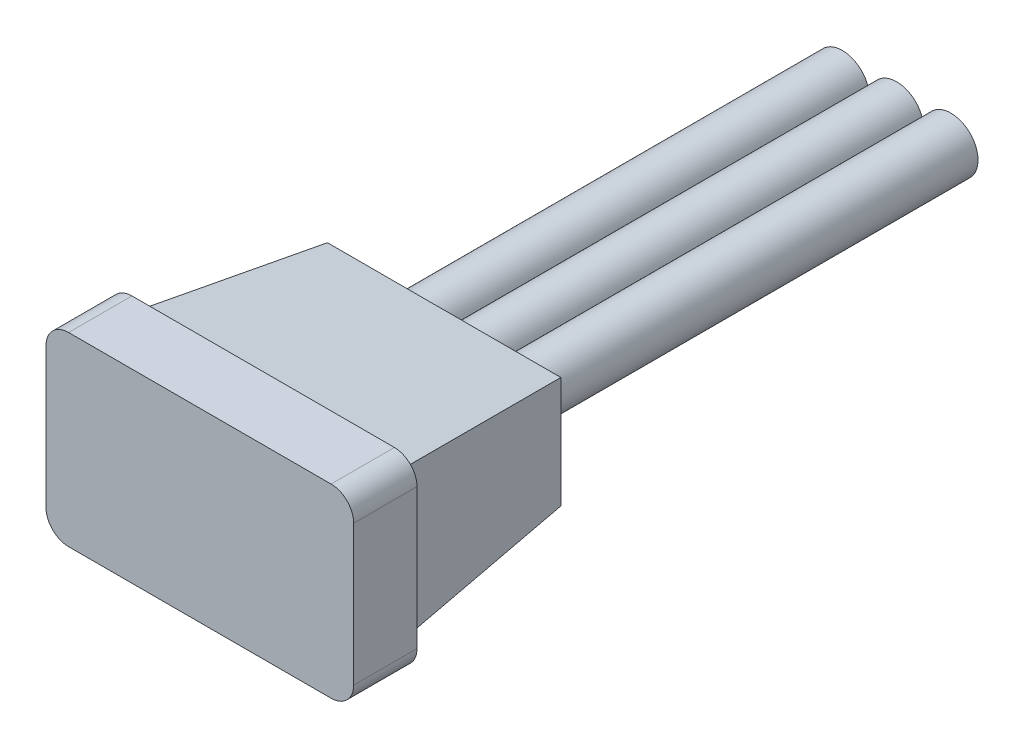
ISO-10303-21;
HEADER;
FILE_DESCRIPTION(('STEP AP214'),'2;1');
FILE_NAME('part.step','',(''),(''),'','','');
FILE_SCHEMA(('AUTOMOTIVE_DESIGN { 1 0 10303 214 1 1 1 1 }'));
ENDSEC;
DATA;
#1=APPLICATION_CONTEXT('core data for automotive mechanical design processes');
#2=APPLICATION_PROTOCOL_DEFINITION('international standard','automotive_design',2000,#1);
#3=PRODUCT_CONTEXT('',#1,'mechanical');
#4=PRODUCT('Part','Part','',(#3));
#5=PRODUCT_RELATED_PRODUCT_CATEGORY('part','',(#4));
#6=PRODUCT_DEFINITION_FORMATION('','',#4);
#7=PRODUCT_DEFINITION_CONTEXT('part definition',#1,'design');
#8=PRODUCT_DEFINITION('design','',#6,#7);
#9=PRODUCT_DEFINITION_SHAPE('','',#8);
#10=(LENGTH_UNIT() NAMED_UNIT(*) SI_UNIT(.MILLI.,.METRE.));
#11=(NAMED_UNIT(*) PLANE_ANGLE_UNIT() SI_UNIT($,.RADIAN.));
#12=(NAMED_UNIT(*) SI_UNIT($,.STERADIAN.) SOLID_ANGLE_UNIT());
#13=UNCERTAINTY_MEASURE_WITH_UNIT(LENGTH_MEASURE(1.E-05),#10,'distance_accuracy_value','');
#14=(GEOMETRIC_REPRESENTATION_CONTEXT(3) GLOBAL_UNCERTAINTY_ASSIGNED_CONTEXT((#13)) GLOBAL_UNIT_ASSIGNED_CONTEXT((#10,
#11,#12)) REPRESENTATION_CONTEXT('',''));
#15=CARTESIAN_POINT('',(0.,0.,0.));
#16=DIRECTION('',(0.,0.,1.));
#17=DIRECTION('',(1.,0.,0.));
#18=AXIS2_PLACEMENT_3D('',#15,#16,#17);
#19=CARTESIAN_POINT('',(1.2,0.,-17.0970562748477));
#20=DIRECTION('',(0.,0.,1.));
#21=DIRECTION('',(1.,0.,0.));
#22=AXIS2_PLACEMENT_3D('',#19,#20,#21);
#23=CYLINDRICAL_SURFACE('',#22,0.6);
#24=CARTESIAN_POINT('',(1.2,0.,-5.4));
#25=DIRECTION('',(0.,0.,-1.));
#26=DIRECTION('',(-1.,0.,0.));
#27=AXIS2_PLACEMENT_3D('',#24,#25,#26);
#28=CIRCLE('',#27,0.6);
#29=CARTESIAN_POINT('',(0.6,0.,-5.4));
#30=VERTEX_POINT('',#29);
#31=EDGE_CURVE('E48',#30,#30,#28,.T.);
#32=ORIENTED_EDGE('',*,*,#31,.T.);
#33=EDGE_LOOP('',(#32));
#34=FACE_BOUND('',#33,.T.);
#35=CARTESIAN_POINT('',(1.2,0.,-15.4));
#36=DIRECTION('',(0.,0.,-1.));
#37=DIRECTION('',(-1.,0.,0.));
#38=AXIS2_PLACEMENT_3D('',#35,#36,#37);
#39=CIRCLE('',#38,0.6);
#40=CARTESIAN_POINT('',(0.6,0.,-15.4));
#41=VERTEX_POINT('',#40);
#42=EDGE_CURVE('E11',#41,#41,#39,.T.);
#43=ORIENTED_EDGE('',*,*,#42,.F.);
#44=EDGE_LOOP('',(#43));
#45=FACE_BOUND('',#44,.T.);
#46=ADVANCED_FACE('F41',(#34,#45),#23,.T.);
#47=CARTESIAN_POINT('',(1.2,0.,-5.4));
#48=DIRECTION('',(0.,0.,-1.));
#49=DIRECTION('',(-1.,0.,0.));
#50=AXIS2_PLACEMENT_3D('',#47,#48,#49);
#51=PLANE('',#50);
#52=ORIENTED_EDGE('',*,*,#31,.F.);
#53=EDGE_LOOP('',(#52));
#54=FACE_BOUND('',#53,.T.);
#55=ADVANCED_FACE('F56',(#54),#51,.F.);
#56=CARTESIAN_POINT('',(0.,0.,-15.4));
#57=DIRECTION('',(0.,0.,-1.));
#58=DIRECTION('',(-1.,0.,0.));
#59=AXIS2_PLACEMENT_3D('',#56,#57,#58);
#60=PLANE('',#59);
#61=ORIENTED_EDGE('',*,*,#42,.T.);
#62=EDGE_LOOP('',(#61));
#63=FACE_BOUND('',#62,.T.);
#64=ADVANCED_FACE('F43',(#63),#60,.T.);
#65=CLOSED_SHELL('',(#46,#55,#64));
#66=MANIFOLD_SOLID_BREP('B2',#65);
#67=CARTESIAN_POINT('',(-1.2,0.,-17.0970562748477));
#68=DIRECTION('',(0.,0.,1.));
#69=DIRECTION('',(1.,0.,0.));
#70=AXIS2_PLACEMENT_3D('',#67,#68,#69);
#71=CYLINDRICAL_SURFACE('',#70,0.6);
#72=CARTESIAN_POINT('',(-1.2,0.,-5.4));
#73=DIRECTION('',(0.,0.,-1.));
#74=DIRECTION('',(-1.,0.,0.));
#75=AXIS2_PLACEMENT_3D('',#72,#73,#74);
#76=CIRCLE('',#75,0.6);
#77=CARTESIAN_POINT('',(-1.8,0.,-5.4));
#78=VERTEX_POINT('',#77);
#79=EDGE_CURVE('E96',#78,#78,#76,.T.);
#80=ORIENTED_EDGE('',*,*,#79,.T.);
#81=EDGE_LOOP('',(#80));
#82=FACE_BOUND('',#81,.T.);
#83=CARTESIAN_POINT('',(-1.2,0.,-15.4));
#84=DIRECTION('',(0.,0.,-1.));
#85=DIRECTION('',(-1.,0.,0.));
#86=AXIS2_PLACEMENT_3D('',#83,#84,#85);
#87=CIRCLE('',#86,0.6);
#88=CARTESIAN_POINT('',(-1.8,0.,-15.4));
#89=VERTEX_POINT('',#88);
#90=EDGE_CURVE('E40',#89,#89,#87,.T.);
#91=ORIENTED_EDGE('',*,*,#90,.F.);
#92=EDGE_LOOP('',(#91));
#93=FACE_BOUND('',#92,.T.);
#94=ADVANCED_FACE('F89',(#82,#93),#71,.T.);
#95=CARTESIAN_POINT('',(-1.2,0.,-5.4));
#96=DIRECTION('',(0.,0.,-1.));
#97=DIRECTION('',(-1.,0.,0.));
#98=AXIS2_PLACEMENT_3D('',#95,#96,#97);
#99=PLANE('',#98);
#100=ORIENTED_EDGE('',*,*,#79,.F.);
#101=EDGE_LOOP('',(#100));
#102=FACE_BOUND('',#101,.T.);
#103=ADVANCED_FACE('F104',(#102),#99,.F.);
#104=CARTESIAN_POINT('',(0.,0.,-15.4));
#105=DIRECTION('',(0.,0.,-1.));
#106=DIRECTION('',(-1.,0.,0.));
#107=AXIS2_PLACEMENT_3D('',#104,#105,#106);
#108=PLANE('',#107);
#109=ORIENTED_EDGE('',*,*,#90,.T.);
#110=EDGE_LOOP('',(#109));
#111=FACE_BOUND('',#110,.T.);
#112=ADVANCED_FACE('F91',(#111),#108,.T.);
#113=CLOSED_SHELL('',(#94,#103,#112));
#114=MANIFOLD_SOLID_BREP('B6',#113);
#115=CARTESIAN_POINT('',(0.,0.,-15.4));
#116=DIRECTION('',(0.,0.,1.));
#117=DIRECTION('',(1.,0.,0.));
#118=AXIS2_PLACEMENT_3D('',#115,#116,#117);
#119=CYLINDRICAL_SURFACE('',#118,0.6);
#120=CARTESIAN_POINT('',(0.,0.,-15.4));
#121=DIRECTION('',(0.,0.,-1.));
#122=DIRECTION('',(-1.,0.,0.));
#123=AXIS2_PLACEMENT_3D('',#120,#121,#122);
#124=CIRCLE('',#123,0.6);
#125=CARTESIAN_POINT('',(-0.6,0.,-15.4));
#126=VERTEX_POINT('',#125);
#127=EDGE_CURVE('E88',#126,#126,#124,.T.);
#128=ORIENTED_EDGE('',*,*,#127,.F.);
#129=EDGE_LOOP('',(#128));
#130=FACE_BOUND('',#129,.T.);
#131=CARTESIAN_POINT('',(0.,0.,-5.4));
#132=DIRECTION('',(0.,0.,-1.));
#133=DIRECTION('',(-1.,0.,0.));
#134=AXIS2_PLACEMENT_3D('',#131,#132,#133);
#135=CIRCLE('',#134,0.6);
#136=CARTESIAN_POINT('',(-0.6,0.,-5.4));
#137=VERTEX_POINT('',#136);
#138=EDGE_CURVE('E141',#137,#137,#135,.T.);
#139=ORIENTED_EDGE('',*,*,#138,.T.);
#140=EDGE_LOOP('',(#139));
#141=FACE_BOUND('',#140,.T.);
#142=ADVANCED_FACE('F138',(#130,#141),#119,.T.);
#143=CARTESIAN_POINT('',(0.,0.,-15.4));
#144=DIRECTION('',(0.,0.,-1.));
#145=DIRECTION('',(-1.,0.,0.));
#146=AXIS2_PLACEMENT_3D('',#143,#144,#145);
#147=PLANE('',#146);
#148=ORIENTED_EDGE('',*,*,#127,.T.);
#149=EDGE_LOOP('',(#148));
#150=FACE_BOUND('',#149,.T.);
#151=ADVANCED_FACE('F153',(#150),#147,.T.);
#152=CARTESIAN_POINT('',(0.,0.,-5.4));
#153=DIRECTION('',(0.,0.,-1.));
#154=DIRECTION('',(-1.,0.,0.));
#155=AXIS2_PLACEMENT_3D('',#152,#153,#154);
#156=PLANE('',#155);
#157=ORIENTED_EDGE('',*,*,#138,.F.);
#158=EDGE_LOOP('',(#157));
#159=FACE_BOUND('',#158,.T.);
#160=ADVANCED_FACE('F151',(#159),#156,.F.);
#161=CLOSED_SHELL('',(#142,#151,#160));
#162=MANIFOLD_SOLID_BREP('B35',#161);
#163=CARTESIAN_POINT('',(0.,0.,-1.4));
#164=DIRECTION('',(0.,0.,1.));
#165=DIRECTION('',(1.,0.,0.));
#166=AXIS2_PLACEMENT_3D('',#163,#164,#165);
#167=PLANE('',#166);
#168=DIRECTION('',(1.,0.,0.));
#169=VECTOR('',#168,1.);
#170=CARTESIAN_POINT('',(-3.4,-2.05,-1.4));
#171=LINE('',#170,#169);
#172=CARTESIAN_POINT('',(-2.9,-2.05,-1.4));
#173=VERTEX_POINT('',#172);
#174=CARTESIAN_POINT('',(2.9,-2.05,-1.4));
#175=VERTEX_POINT('',#174);
#176=EDGE_CURVE('E316',#173,#175,#171,.T.);
#177=ORIENTED_EDGE('',*,*,#176,.F.);
#178=CARTESIAN_POINT('',(-2.9,-1.55,-1.4));
#179=DIRECTION('',(0.,0.,1.));
#180=DIRECTION('',(1.,0.,0.));
#181=AXIS2_PLACEMENT_3D('',#178,#179,#180);
#182=CIRCLE('',#181,0.5);
#183=CARTESIAN_POINT('',(-3.4,-1.55,-1.4));
#184=VERTEX_POINT('',#183);
#185=EDGE_CURVE('E353',#173,#184,#182,.F.);
#186=ORIENTED_EDGE('',*,*,#185,.T.);
#187=DIRECTION('',(0.,-1.,0.));
#188=VECTOR('',#187,1.);
#189=CARTESIAN_POINT('',(-3.4,2.05,-1.4));
#190=LINE('',#189,#188);
#191=CARTESIAN_POINT('',(-3.4,1.55,-1.4));
#192=VERTEX_POINT('',#191);
#193=EDGE_CURVE('E313',#192,#184,#190,.T.);
#194=ORIENTED_EDGE('',*,*,#193,.F.);
#195=CARTESIAN_POINT('',(-2.9,1.55,-1.4));
#196=DIRECTION('',(0.,0.,1.));
#197=DIRECTION('',(1.,0.,0.));
#198=AXIS2_PLACEMENT_3D('',#195,#196,#197);
#199=CIRCLE('',#198,0.5);
#200=CARTESIAN_POINT('',(-2.9,2.05,-1.4));
#201=VERTEX_POINT('',#200);
#202=EDGE_CURVE('E193',#192,#201,#199,.F.);
#203=ORIENTED_EDGE('',*,*,#202,.T.);
#204=DIRECTION('',(-1.,0.,0.));
#205=VECTOR('',#204,1.);
#206=CARTESIAN_POINT('',(-3.4,2.05,-1.4));
#207=LINE('',#206,#205);
#208=CARTESIAN_POINT('',(2.9,2.05,-1.4));
#209=VERTEX_POINT('',#208);
#210=EDGE_CURVE('E310',#209,#201,#207,.T.);
#211=ORIENTED_EDGE('',*,*,#210,.F.);
#212=CARTESIAN_POINT('',(2.9,1.55,-1.4));
#213=DIRECTION('',(0.,0.,1.));
#214=DIRECTION('',(1.,0.,0.));
#215=AXIS2_PLACEMENT_3D('',#212,#213,#214);
#216=CIRCLE('',#215,0.5);
#217=CARTESIAN_POINT('',(3.4,1.55,-1.4));
#218=VERTEX_POINT('',#217);
#219=EDGE_CURVE('E348',#209,#218,#216,.F.);
#220=ORIENTED_EDGE('',*,*,#219,.T.);
#221=DIRECTION('',(0.,1.,0.));
#222=VECTOR('',#221,1.);
#223=CARTESIAN_POINT('',(3.4,2.05,-1.4));
#224=LINE('',#223,#222);
#225=CARTESIAN_POINT('',(3.4,-1.55,-1.4));
#226=VERTEX_POINT('',#225);
#227=EDGE_CURVE('E307',#226,#218,#224,.T.);
#228=ORIENTED_EDGE('',*,*,#227,.F.);
#229=CARTESIAN_POINT('',(2.9,-1.55,-1.4));
#230=DIRECTION('',(0.,0.,1.));
#231=DIRECTION('',(1.,0.,0.));
#232=AXIS2_PLACEMENT_3D('',#229,#230,#231);
#233=CIRCLE('',#232,0.5);
#234=EDGE_CURVE('E350',#226,#175,#233,.F.);
#235=ORIENTED_EDGE('',*,*,#234,.T.);
#236=EDGE_LOOP('',(#177,#186,#194,#203,#211,#220,#228,#235));
#237=FACE_BOUND('',#236,.T.);
#238=DIRECTION('',(0.,-1.,0.));
#239=VECTOR('',#238,1.);
#240=CARTESIAN_POINT('',(3.,1.65,-1.4));
#241=LINE('',#240,#239);
#242=CARTESIAN_POINT('',(3.,1.65,-1.4));
#243=VERTEX_POINT('',#242);
#244=CARTESIAN_POINT('',(3.,-1.65,-1.4));
#245=VERTEX_POINT('',#244);
#246=EDGE_CURVE('E267',#243,#245,#241,.T.);
#247=ORIENTED_EDGE('',*,*,#246,.F.);
#248=DIRECTION('',(1.,0.,0.));
#249=VECTOR('',#248,1.);
#250=CARTESIAN_POINT('',(-3.,1.65,-1.4));
#251=LINE('',#250,#249);
#252=CARTESIAN_POINT('',(-3.,1.65,-1.4));
#253=VERTEX_POINT('',#252);
#254=EDGE_CURVE('E269',#253,#243,#251,.T.);
#255=ORIENTED_EDGE('',*,*,#254,.F.);
#256=DIRECTION('',(0.,1.,0.));
#257=VECTOR('',#256,1.);
#258=CARTESIAN_POINT('',(-3.,1.65,-1.4));
#259=LINE('',#258,#257);
#260=CARTESIAN_POINT('',(-3.,-1.65,-1.4));
#261=VERTEX_POINT('',#260);
#262=EDGE_CURVE('E288',#261,#253,#259,.T.);
#263=ORIENTED_EDGE('',*,*,#262,.F.);
#264=DIRECTION('',(-1.,0.,0.));
#265=VECTOR('',#264,1.);
#266=CARTESIAN_POINT('',(-3.,-1.65,-1.4));
#267=LINE('',#266,#265);
#268=EDGE_CURVE('E272',#245,#261,#267,.T.);
#269=ORIENTED_EDGE('',*,*,#268,.F.);
#270=EDGE_LOOP('',(#247,#255,#263,#269));
#271=FACE_BOUND('',#270,.T.);
#272=ADVANCED_FACE('F178',(#237,#271),#167,.F.);
#273=CARTESIAN_POINT('',(3.4,2.05,-1.4));
#274=DIRECTION('',(1.,0.,0.));
#275=DIRECTION('',(0.,1.,0.));
#276=AXIS2_PLACEMENT_3D('',#273,#274,#275);
#277=PLANE('',#276);
#278=DIRECTION('',(0.,1.,0.));
#279=VECTOR('',#278,1.);
#280=CARTESIAN_POINT('',(3.4,2.05,0.));
#281=LINE('',#280,#279);
#282=CARTESIAN_POINT('',(3.4,-1.55,0.));
#283=VERTEX_POINT('',#282);
#284=CARTESIAN_POINT('',(3.4,1.55,0.));
#285=VERTEX_POINT('',#284);
#286=EDGE_CURVE('E320',#283,#285,#281,.T.);
#287=ORIENTED_EDGE('',*,*,#286,.F.);
#288=DIRECTION('',(0.,0.,1.));
#289=VECTOR('',#288,1.);
#290=CARTESIAN_POINT('',(3.4,-1.55,-1.4));
#291=LINE('',#290,#289);
#292=EDGE_CURVE('E136',#283,#226,#291,.F.);
#293=ORIENTED_EDGE('',*,*,#292,.T.);
#294=ORIENTED_EDGE('',*,*,#227,.T.);
#295=DIRECTION('',(0.,0.,1.));
#296=VECTOR('',#295,1.);
#297=CARTESIAN_POINT('',(3.4,1.55,-1.4));
#298=LINE('',#297,#296);
#299=EDGE_CURVE('E186',#218,#285,#298,.T.);
#300=ORIENTED_EDGE('',*,*,#299,.T.);
#301=EDGE_LOOP('',(#287,#293,#294,#300));
#302=FACE_BOUND('',#301,.T.);
#303=ADVANCED_FACE('F362',(#302),#277,.T.);
#304=CARTESIAN_POINT('',(-3.4,-2.05,-1.4));
#305=DIRECTION('',(0.,-1.,0.));
#306=DIRECTION('',(0.,0.,-1.));
#307=AXIS2_PLACEMENT_3D('',#304,#305,#306);
#308=PLANE('',#307);
#309=DIRECTION('',(1.,0.,0.));
#310=VECTOR('',#309,1.);
#311=CARTESIAN_POINT('',(-3.4,-2.05,0.));
#312=LINE('',#311,#310);
#313=CARTESIAN_POINT('',(-2.9,-2.05,0.));
#314=VERTEX_POINT('',#313);
#315=CARTESIAN_POINT('',(2.9,-2.05,0.));
#316=VERTEX_POINT('',#315);
#317=EDGE_CURVE('E311',#314,#316,#312,.T.);
#318=ORIENTED_EDGE('',*,*,#317,.F.);
#319=DIRECTION('',(0.,0.,1.));
#320=VECTOR('',#319,1.);
#321=CARTESIAN_POINT('',(-2.9,-2.05,-1.4));
#322=LINE('',#321,#320);
#323=EDGE_CURVE('E346',#314,#173,#322,.F.);
#324=ORIENTED_EDGE('',*,*,#323,.T.);
#325=ORIENTED_EDGE('',*,*,#176,.T.);
#326=DIRECTION('',(0.,0.,1.));
#327=VECTOR('',#326,1.);
#328=CARTESIAN_POINT('',(2.9,-2.05,-1.4));
#329=LINE('',#328,#327);
#330=EDGE_CURVE('E343',#175,#316,#329,.T.);
#331=ORIENTED_EDGE('',*,*,#330,.T.);
#332=EDGE_LOOP('',(#318,#324,#325,#331));
#333=FACE_BOUND('',#332,.T.);
#334=ADVANCED_FACE('F375',(#333),#308,.T.);
#335=CARTESIAN_POINT('',(-3.4,2.05,-1.4));
#336=DIRECTION('',(-1.,0.,0.));
#337=DIRECTION('',(0.,-1.,0.));
#338=AXIS2_PLACEMENT_3D('',#335,#336,#337);
#339=PLANE('',#338);
#340=ORIENTED_EDGE('',*,*,#193,.T.);
#341=DIRECTION('',(0.,0.,1.));
#342=VECTOR('',#341,1.);
#343=CARTESIAN_POINT('',(-3.4,-1.55,-1.4));
#344=LINE('',#343,#342);
#345=CARTESIAN_POINT('',(-3.4,-1.55,0.));
#346=VERTEX_POINT('',#345);
#347=EDGE_CURVE('E332',#184,#346,#344,.T.);
#348=ORIENTED_EDGE('',*,*,#347,.T.);
#349=DIRECTION('',(0.,-1.,0.));
#350=VECTOR('',#349,1.);
#351=CARTESIAN_POINT('',(-3.4,2.05,0.));
#352=LINE('',#351,#350);
#353=CARTESIAN_POINT('',(-3.4,1.55,0.));
#354=VERTEX_POINT('',#353);
#355=EDGE_CURVE('E326',#354,#346,#352,.T.);
#356=ORIENTED_EDGE('',*,*,#355,.F.);
#357=DIRECTION('',(0.,0.,1.));
#358=VECTOR('',#357,1.);
#359=CARTESIAN_POINT('',(-3.4,1.55,-1.4));
#360=LINE('',#359,#358);
#361=EDGE_CURVE('E319',#354,#192,#360,.F.);
#362=ORIENTED_EDGE('',*,*,#361,.T.);
#363=EDGE_LOOP('',(#340,#348,#356,#362));
#364=FACE_BOUND('',#363,.T.);
#365=ADVANCED_FACE('F384',(#364),#339,.T.);
#366=CARTESIAN_POINT('',(-3.4,2.05,-1.4));
#367=DIRECTION('',(0.,1.,0.));
#368=DIRECTION('',(0.,0.,1.));
#369=AXIS2_PLACEMENT_3D('',#366,#367,#368);
#370=PLANE('',#369);
#371=ORIENTED_EDGE('',*,*,#210,.T.);
#372=DIRECTION('',(0.,0.,1.));
#373=VECTOR('',#372,1.);
#374=CARTESIAN_POINT('',(-2.9,2.05,-1.4));
#375=LINE('',#374,#373);
#376=CARTESIAN_POINT('',(-2.9,2.05,0.));
#377=VERTEX_POINT('',#376);
#378=EDGE_CURVE('E356',#201,#377,#375,.T.);
#379=ORIENTED_EDGE('',*,*,#378,.T.);
#380=DIRECTION('',(-1.,0.,0.));
#381=VECTOR('',#380,1.);
#382=CARTESIAN_POINT('',(-3.4,2.05,0.));
#383=LINE('',#382,#381);
#384=CARTESIAN_POINT('',(2.9,2.05,0.));
#385=VERTEX_POINT('',#384);
#386=EDGE_CURVE('E323',#385,#377,#383,.T.);
#387=ORIENTED_EDGE('',*,*,#386,.F.);
#388=DIRECTION('',(0.,0.,1.));
#389=VECTOR('',#388,1.);
#390=CARTESIAN_POINT('',(2.9,2.05,-1.4));
#391=LINE('',#390,#389);
#392=EDGE_CURVE('E200',#385,#209,#391,.F.);
#393=ORIENTED_EDGE('',*,*,#392,.T.);
#394=EDGE_LOOP('',(#371,#379,#387,#393));
#395=FACE_BOUND('',#394,.T.);
#396=ADVANCED_FACE('F389',(#395),#370,.T.);
#397=CARTESIAN_POINT('',(0.,0.,0.));
#398=DIRECTION('',(0.,0.,1.));
#399=DIRECTION('',(1.,0.,0.));
#400=AXIS2_PLACEMENT_3D('',#397,#398,#399);
#401=PLANE('',#400);
#402=ORIENTED_EDGE('',*,*,#355,.T.);
#403=CARTESIAN_POINT('',(-2.9,-1.55,0.));
#404=DIRECTION('',(0.,0.,1.));
#405=DIRECTION('',(1.,0.,0.));
#406=AXIS2_PLACEMENT_3D('',#403,#404,#405);
#407=CIRCLE('',#406,0.5);
#408=EDGE_CURVE('E341',#346,#314,#407,.T.);
#409=ORIENTED_EDGE('',*,*,#408,.T.);
#410=ORIENTED_EDGE('',*,*,#317,.T.);
#411=CARTESIAN_POINT('',(2.9,-1.55,0.));
#412=DIRECTION('',(0.,0.,1.));
#413=DIRECTION('',(1.,0.,0.));
#414=AXIS2_PLACEMENT_3D('',#411,#412,#413);
#415=CIRCLE('',#414,0.5);
#416=EDGE_CURVE('E337',#316,#283,#415,.T.);
#417=ORIENTED_EDGE('',*,*,#416,.T.);
#418=ORIENTED_EDGE('',*,*,#286,.T.);
#419=CARTESIAN_POINT('',(2.9,1.55,0.));
#420=DIRECTION('',(0.,0.,1.));
#421=DIRECTION('',(1.,0.,0.));
#422=AXIS2_PLACEMENT_3D('',#419,#420,#421);
#423=CIRCLE('',#422,0.5);
#424=EDGE_CURVE('E335',#285,#385,#423,.T.);
#425=ORIENTED_EDGE('',*,*,#424,.T.);
#426=ORIENTED_EDGE('',*,*,#386,.T.);
#427=CARTESIAN_POINT('',(-2.9,1.55,0.));
#428=DIRECTION('',(0.,0.,1.));
#429=DIRECTION('',(1.,0.,0.));
#430=AXIS2_PLACEMENT_3D('',#427,#428,#429);
#431=CIRCLE('',#430,0.5);
#432=EDGE_CURVE('E339',#377,#354,#431,.T.);
#433=ORIENTED_EDGE('',*,*,#432,.T.);
#434=EDGE_LOOP('',(#402,#409,#410,#417,#418,#425,#426,#433));
#435=FACE_BOUND('',#434,.T.);
#436=ADVANCED_FACE('F368',(#435),#401,.T.);
#437=CARTESIAN_POINT('',(3.,1.65,-1.4));
#438=DIRECTION('',(0.994521895368273,0.,-0.104528463267654));
#439=DIRECTION('',(-0.104528463267654,0.,-0.994521895368273));
#440=AXIS2_PLACEMENT_3D('',#437,#438,#439);
#441=PLANE('',#440);
#442=ORIENTED_EDGE('',*,*,#246,.T.);
#443=DIRECTION('',(0.103962051184498,-0.103962051184498,0.989132844377854));
#444=VECTOR('',#443,1.);
#445=CARTESIAN_POINT('',(2.93515135148107,-1.58515135148107,-2.01699367637287));
#446=LINE('',#445,#444);
#447=CARTESIAN_POINT('',(2.57958305893729,-1.22958305893729,-5.4));
#448=VERTEX_POINT('',#447);
#449=EDGE_CURVE('E299',#448,#245,#446,.T.);
#450=ORIENTED_EDGE('',*,*,#449,.F.);
#451=DIRECTION('',(0.,1.,0.));
#452=VECTOR('',#451,1.);
#453=CARTESIAN_POINT('',(2.57958305893729,0.,-5.4));
#454=LINE('',#453,#452);
#455=CARTESIAN_POINT('',(2.57958305893729,1.22958305893729,-5.4));
#456=VERTEX_POINT('',#455);
#457=EDGE_CURVE('E287',#456,#448,#454,.F.);
#458=ORIENTED_EDGE('',*,*,#457,.F.);
#459=DIRECTION('',(0.103962051184498,0.103962051184498,0.989132844377854));
#460=VECTOR('',#459,1.);
#461=CARTESIAN_POINT('',(3.,1.65,-1.4));
#462=LINE('',#461,#460);
#463=EDGE_CURVE('E283',#456,#243,#462,.T.);
#464=ORIENTED_EDGE('',*,*,#463,.T.);
#465=EDGE_LOOP('',(#442,#450,#458,#464));
#466=FACE_BOUND('',#465,.T.);
#467=ADVANCED_FACE('F290',(#466),#441,.T.);
#468=CARTESIAN_POINT('',(-3.,-1.65,-1.4));
#469=DIRECTION('',(0.,-0.994521895368273,-0.104528463267654));
#470=DIRECTION('',(0.,0.104528463267654,-0.994521895368273));
#471=AXIS2_PLACEMENT_3D('',#468,#469,#470);
#472=PLANE('',#471);
#473=ORIENTED_EDGE('',*,*,#268,.T.);
#474=DIRECTION('',(-0.103962051184498,-0.103962051184498,0.989132844377854));
#475=VECTOR('',#474,1.);
#476=CARTESIAN_POINT('',(-2.96433324331459,-1.61433324331459,-1.73934652200508));
#477=LINE('',#476,#475);
#478=CARTESIAN_POINT('',(-2.57958305893729,-1.22958305893729,-5.4));
#479=VERTEX_POINT('',#478);
#480=EDGE_CURVE('E294',#479,#261,#477,.T.);
#481=ORIENTED_EDGE('',*,*,#480,.F.);
#482=DIRECTION('',(1.,0.,0.));
#483=VECTOR('',#482,1.);
#484=CARTESIAN_POINT('',(0.,-1.22958305893729,-5.4));
#485=LINE('',#484,#483);
#486=EDGE_CURVE('E304',#448,#479,#485,.F.);
#487=ORIENTED_EDGE('',*,*,#486,.F.);
#488=ORIENTED_EDGE('',*,*,#449,.T.);
#489=EDGE_LOOP('',(#473,#481,#487,#488));
#490=FACE_BOUND('',#489,.T.);
#491=ADVANCED_FACE('F402',(#490),#472,.T.);
#492=CARTESIAN_POINT('',(-3.,1.65,-1.4));
#493=DIRECTION('',(-0.994521895368273,0.,-0.104528463267654));
#494=DIRECTION('',(-0.104528463267654,0.,0.994521895368273));
#495=AXIS2_PLACEMENT_3D('',#492,#493,#494);
#496=PLANE('',#495);
#497=ORIENTED_EDGE('',*,*,#262,.T.);
#498=DIRECTION('',(-0.103962051184498,0.103962051184498,0.989132844377854));
#499=VECTOR('',#498,1.);
#500=CARTESIAN_POINT('',(-3.,1.65,-1.4));
#501=LINE('',#500,#499);
#502=CARTESIAN_POINT('',(-2.57958305893729,1.22958305893729,-5.4));
#503=VERTEX_POINT('',#502);
#504=EDGE_CURVE('E286',#503,#253,#501,.T.);
#505=ORIENTED_EDGE('',*,*,#504,.F.);
#506=DIRECTION('',(0.,-1.,0.));
#507=VECTOR('',#506,1.);
#508=CARTESIAN_POINT('',(-2.57958305893729,0.,-5.4));
#509=LINE('',#508,#507);
#510=EDGE_CURVE('E296',#479,#503,#509,.F.);
#511=ORIENTED_EDGE('',*,*,#510,.F.);
#512=ORIENTED_EDGE('',*,*,#480,.T.);
#513=EDGE_LOOP('',(#497,#505,#511,#512));
#514=FACE_BOUND('',#513,.T.);
#515=ADVANCED_FACE('F453',(#514),#496,.T.);
#516=CARTESIAN_POINT('',(-3.,1.65,-1.4));
#517=DIRECTION('',(0.,0.994521895368273,-0.104528463267654));
#518=DIRECTION('',(0.,0.104528463267654,0.994521895368273));
#519=AXIS2_PLACEMENT_3D('',#516,#517,#518);
#520=PLANE('',#519);
#521=ORIENTED_EDGE('',*,*,#254,.T.);
#522=ORIENTED_EDGE('',*,*,#463,.F.);
#523=DIRECTION('',(-1.,0.,0.));
#524=VECTOR('',#523,1.);
#525=CARTESIAN_POINT('',(0.,1.22958305893729,-5.4));
#526=LINE('',#525,#524);
#527=EDGE_CURVE('E292',#503,#456,#526,.F.);
#528=ORIENTED_EDGE('',*,*,#527,.F.);
#529=ORIENTED_EDGE('',*,*,#504,.T.);
#530=EDGE_LOOP('',(#521,#522,#528,#529));
#531=FACE_BOUND('',#530,.T.);
#532=ADVANCED_FACE('F281',(#531),#520,.T.);
#533=CARTESIAN_POINT('',(0.,0.,-5.4));
#534=DIRECTION('',(0.,0.,1.));
#535=DIRECTION('',(1.,0.,0.));
#536=AXIS2_PLACEMENT_3D('',#533,#534,#535);
#537=PLANE('',#536);
#538=ORIENTED_EDGE('',*,*,#457,.T.);
#539=ORIENTED_EDGE('',*,*,#486,.T.);
#540=ORIENTED_EDGE('',*,*,#510,.T.);
#541=ORIENTED_EDGE('',*,*,#527,.T.);
#542=EDGE_LOOP('',(#538,#539,#540,#541));
#543=FACE_BOUND('',#542,.T.);
#544=ADVANCED_FACE('F414',(#543),#537,.F.);
#545=CARTESIAN_POINT('',(-2.9,-1.55,-1.4));
#546=DIRECTION('',(0.,0.,1.));
#547=DIRECTION('',(1.,0.,0.));
#548=AXIS2_PLACEMENT_3D('',#545,#546,#547);
#549=CYLINDRICAL_SURFACE('',#548,0.5);
#550=ORIENTED_EDGE('',*,*,#185,.F.);
#551=ORIENTED_EDGE('',*,*,#323,.F.);
#552=ORIENTED_EDGE('',*,*,#408,.F.);
#553=ORIENTED_EDGE('',*,*,#347,.F.);
#554=EDGE_LOOP('',(#550,#551,#552,#553));
#555=FACE_BOUND('',#554,.T.);
#556=ADVANCED_FACE('F381',(#555),#549,.T.);
#557=CARTESIAN_POINT('',(-2.9,1.55,-1.4));
#558=DIRECTION('',(0.,0.,1.));
#559=DIRECTION('',(1.,0.,0.));
#560=AXIS2_PLACEMENT_3D('',#557,#558,#559);
#561=CYLINDRICAL_SURFACE('',#560,0.5);
#562=ORIENTED_EDGE('',*,*,#202,.F.);
#563=ORIENTED_EDGE('',*,*,#361,.F.);
#564=ORIENTED_EDGE('',*,*,#432,.F.);
#565=ORIENTED_EDGE('',*,*,#378,.F.);
#566=EDGE_LOOP('',(#562,#563,#564,#565));
#567=FACE_BOUND('',#566,.T.);
#568=ADVANCED_FACE('F388',(#567),#561,.T.);
#569=CARTESIAN_POINT('',(2.9,-1.55,-1.4));
#570=DIRECTION('',(0.,0.,1.));
#571=DIRECTION('',(1.,0.,0.));
#572=AXIS2_PLACEMENT_3D('',#569,#570,#571);
#573=CYLINDRICAL_SURFACE('',#572,0.5);
#574=ORIENTED_EDGE('',*,*,#234,.F.);
#575=ORIENTED_EDGE('',*,*,#292,.F.);
#576=ORIENTED_EDGE('',*,*,#416,.F.);
#577=ORIENTED_EDGE('',*,*,#330,.F.);
#578=EDGE_LOOP('',(#574,#575,#576,#577));
#579=FACE_BOUND('',#578,.T.);
#580=ADVANCED_FACE('F373',(#579),#573,.T.);
#581=CARTESIAN_POINT('',(2.9,1.55,-1.4));
#582=DIRECTION('',(0.,0.,1.));
#583=DIRECTION('',(1.,0.,0.));
#584=AXIS2_PLACEMENT_3D('',#581,#582,#583);
#585=CYLINDRICAL_SURFACE('',#584,0.5);
#586=ORIENTED_EDGE('',*,*,#219,.F.);
#587=ORIENTED_EDGE('',*,*,#392,.F.);
#588=ORIENTED_EDGE('',*,*,#424,.F.);
#589=ORIENTED_EDGE('',*,*,#299,.F.);
#590=EDGE_LOOP('',(#586,#587,#588,#589));
#591=FACE_BOUND('',#590,.T.);
#592=ADVANCED_FACE('F180',(#591),#585,.T.);
#593=CLOSED_SHELL('',(#272,#303,#334,#365,#396,#436,#467,#491,#515,#532,#544,#556,#568,#580,#592));
#594=MANIFOLD_SOLID_BREP('B83',#593);
#595=ADVANCED_BREP_SHAPE_REPRESENTATION('',(#18,#66,#114,#162,#594),#14);
#596=SHAPE_DEFINITION_REPRESENTATION(#9,#595);
ENDSEC;
END-ISO-10303-21;
